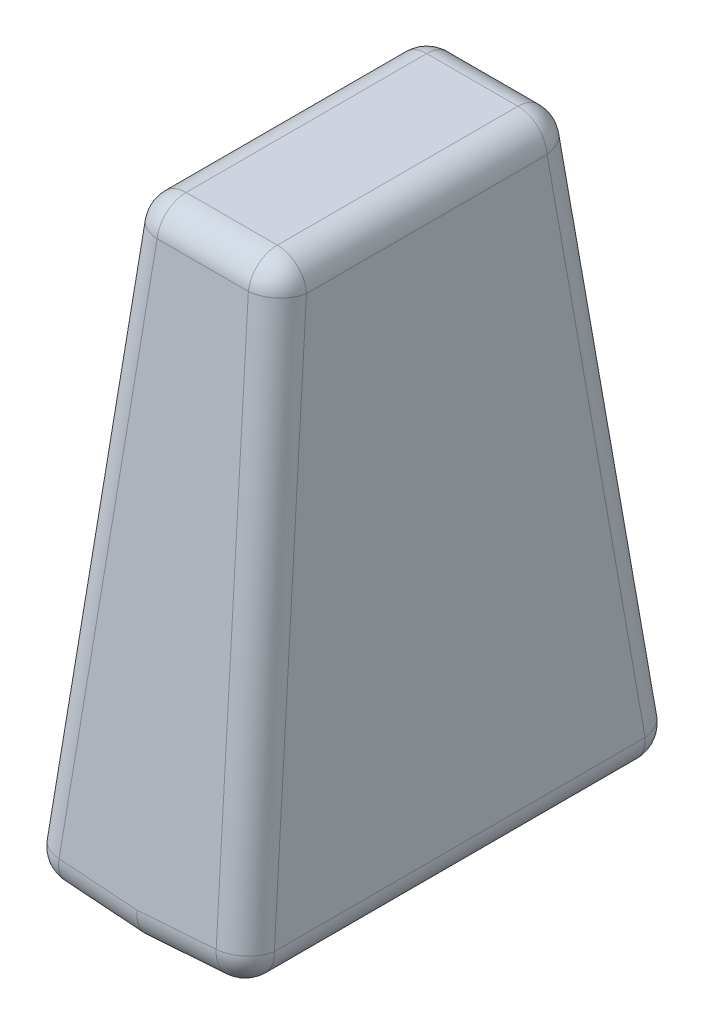
ISO-10303-21;
HEADER;
FILE_DESCRIPTION(('STEP AP214'),'2;1');
FILE_NAME('part.step','',(''),(''),'','','');
FILE_SCHEMA(('AUTOMOTIVE_DESIGN { 1 0 10303 214 1 1 1 1 }'));
ENDSEC;
DATA;
#1=APPLICATION_CONTEXT('core data for automotive mechanical design processes');
#2=APPLICATION_PROTOCOL_DEFINITION('international standard','automotive_design',2000,#1);
#3=PRODUCT_CONTEXT('',#1,'mechanical');
#4=PRODUCT('Part','Part','',(#3));
#5=PRODUCT_RELATED_PRODUCT_CATEGORY('part','',(#4));
#6=PRODUCT_DEFINITION_FORMATION('','',#4);
#7=PRODUCT_DEFINITION_CONTEXT('part definition',#1,'design');
#8=PRODUCT_DEFINITION('design','',#6,#7);
#9=PRODUCT_DEFINITION_SHAPE('','',#8);
#10=(LENGTH_UNIT() NAMED_UNIT(*) SI_UNIT(.MILLI.,.METRE.));
#11=(NAMED_UNIT(*) PLANE_ANGLE_UNIT() SI_UNIT($,.RADIAN.));
#12=(NAMED_UNIT(*) SI_UNIT($,.STERADIAN.) SOLID_ANGLE_UNIT());
#13=UNCERTAINTY_MEASURE_WITH_UNIT(LENGTH_MEASURE(1.E-05),#10,'distance_accuracy_value','');
#14=(GEOMETRIC_REPRESENTATION_CONTEXT(3) GLOBAL_UNCERTAINTY_ASSIGNED_CONTEXT((#13)) GLOBAL_UNIT_ASSIGNED_CONTEXT((#10,
#11,#12)) REPRESENTATION_CONTEXT('',''));
#15=CARTESIAN_POINT('',(0.,0.,0.));
#16=DIRECTION('',(0.,0.,1.));
#17=DIRECTION('',(1.,0.,0.));
#18=AXIS2_PLACEMENT_3D('',#15,#16,#17);
#19=CARTESIAN_POINT('',(-7.5,0.474375810233363,30.));
#20=DIRECTION('',(0.998005693706794,-0.0631239679426227,0.));
#21=DIRECTION('',(0.0631239679426227,0.998005693706794,0.));
#22=AXIS2_PLACEMENT_3D('',#19,#20,#21);
#23=PLANE('',#22);
#24=DIRECTION('',(0.,0.,-1.));
#25=VECTOR('',#24,1.);
#26=CARTESIAN_POINT('',(-5.11851502047879,38.1262479358852,30.));
#27=LINE('',#26,#25);
#28=CARTESIAN_POINT('',(-5.11851502047879,38.1262479358852,23.2344355629254));
#29=VERTEX_POINT('',#28);
#30=CARTESIAN_POINT('',(-5.11851502047879,38.1262479358852,6.76556443707463));
#31=VERTEX_POINT('',#30);
#32=EDGE_CURVE('E273',#29,#31,#27,.T.);
#33=ORIENTED_EDGE('',*,*,#32,.T.);
#34=DIRECTION('',(-0.0626384368425674,-0.990329325789502,-0.123791165723688));
#35=VECTOR('',#34,1.);
#36=CARTESIAN_POINT('',(-7.28334373137214,3.89976551109013,2.48725413397524));
#37=LINE('',#36,#35);
#38=CARTESIAN_POINT('',(-7.37375206411475,2.47038719764695,2.30858184479484));
#39=VERTEX_POINT('',#38);
#40=EDGE_CURVE('E201',#31,#39,#37,.T.);
#41=ORIENTED_EDGE('',*,*,#40,.T.);
#42=DIRECTION('',(0.,0.,-1.));
#43=VECTOR('',#42,1.);
#44=CARTESIAN_POINT('',(-7.37375206411475,2.47038719764695,30.));
#45=LINE('',#44,#43);
#46=CARTESIAN_POINT('',(-7.37375206411475,2.47038719764695,27.6914181552051));
#47=VERTEX_POINT('',#46);
#48=EDGE_CURVE('E174',#47,#39,#45,.T.);
#49=ORIENTED_EDGE('',*,*,#48,.F.);
#50=DIRECTION('',(-0.0626384368425674,-0.990329325789502,0.123791165723688));
#51=VECTOR('',#50,1.);
#52=CARTESIAN_POINT('',(-5.13402151152527,37.881086440843,23.2650807498056));
#53=LINE('',#52,#51);
#54=EDGE_CURVE('E198',#47,#29,#53,.F.);
#55=ORIENTED_EDGE('',*,*,#54,.T.);
#56=EDGE_LOOP('',(#33,#41,#49,#55));
#57=FACE_BOUND('',#56,.T.);
#58=ADVANCED_FACE('F40',(#57),#23,.F.);
#59=CARTESIAN_POINT('',(-5.37774067670117,2.34413926176169,30.));
#60=DIRECTION('',(0.,0.,-1.));
#61=DIRECTION('',(-1.,0.,0.));
#62=AXIS2_PLACEMENT_3D('',#59,#60,#61);
#63=CYLINDRICAL_SURFACE('',#62,2.);
#64=ORIENTED_EDGE('',*,*,#48,.T.);
#65=CARTESIAN_POINT('',(-5.37774067670117,2.34413926176169,2.30858184479484));
#66=DIRECTION('',(0.,0.,-1.));
#67=DIRECTION('',(-1.,0.,0.));
#68=AXIS2_PLACEMENT_3D('',#65,#66,#67);
#69=CIRCLE('',#68,2.);
#70=CARTESIAN_POINT('',(-5.50398861258639,0.348127874348098,2.30858184479484));
#71=VERTEX_POINT('',#70);
#72=EDGE_CURVE('E207',#39,#71,#69,.F.);
#73=ORIENTED_EDGE('',*,*,#72,.T.);
#74=DIRECTION('',(0.,0.,-1.));
#75=VECTOR('',#74,1.);
#76=CARTESIAN_POINT('',(-5.50398861258639,0.348127874348098,30.));
#77=LINE('',#76,#75);
#78=CARTESIAN_POINT('',(-5.50398861258639,0.348127874348098,27.6914181552052));
#79=VERTEX_POINT('',#78);
#80=EDGE_CURVE('E322',#79,#71,#77,.T.);
#81=ORIENTED_EDGE('',*,*,#80,.F.);
#82=CARTESIAN_POINT('',(-5.37774067670117,2.34413926176169,27.6914181552052));
#83=DIRECTION('',(0.,0.,-1.));
#84=DIRECTION('',(-1.,0.,0.));
#85=AXIS2_PLACEMENT_3D('',#82,#83,#84);
#86=CIRCLE('',#85,2.);
#87=EDGE_CURVE('E204',#79,#47,#86,.T.);
#88=ORIENTED_EDGE('',*,*,#87,.T.);
#89=EDGE_LOOP('',(#64,#73,#81,#88));
#90=FACE_BOUND('',#89,.T.);
#91=ADVANCED_FACE('F319',(#90),#63,.T.);
#92=CARTESIAN_POINT('',(0.,0.,30.));
#93=DIRECTION('',(0.0631239679426192,0.998005693706794,0.));
#94=DIRECTION('',(-0.998005693706794,0.0631239679426192,0.));
#95=AXIS2_PLACEMENT_3D('',#92,#93,#94);
#96=PLANE('',#95);
#97=ORIENTED_EDGE('',*,*,#80,.T.);
#98=DIRECTION('',(0.997974627276607,-0.0631220029875538,-0.00789025037344378));
#99=VECTOR('',#98,1.);
#100=CARTESIAN_POINT('',(-0.218392350848216,0.0138133397843181,2.26679252797437));
#101=LINE('',#100,#99);
#102=CARTESIAN_POINT('',(0.,0.,2.26506586050133));
#103=VERTEX_POINT('',#102);
#104=EDGE_CURVE('E213',#71,#103,#101,.T.);
#105=ORIENTED_EDGE('',*,*,#104,.T.);
#106=DIRECTION('',(0.,0.,-1.));
#107=VECTOR('',#106,1.);
#108=CARTESIAN_POINT('',(0.,0.,30.));
#109=LINE('',#108,#107);
#110=CARTESIAN_POINT('',(0.,0.,27.7349341394987));
#111=VERTEX_POINT('',#110);
#112=EDGE_CURVE('E330',#111,#103,#109,.T.);
#113=ORIENTED_EDGE('',*,*,#112,.F.);
#114=DIRECTION('',(0.997974627276607,-0.0631220029875538,0.00789025037344379));
#115=VECTOR('',#114,1.);
#116=CARTESIAN_POINT('',(-5.48615287316791,0.346999761903064,27.6915591692608));
#117=LINE('',#116,#115);
#118=EDGE_CURVE('E210',#111,#79,#117,.F.);
#119=ORIENTED_EDGE('',*,*,#118,.T.);
#120=EDGE_LOOP('',(#97,#105,#113,#119));
#121=FACE_BOUND('',#120,.T.);
#122=ADVANCED_FACE('F432',(#121),#96,.F.);
#123=CARTESIAN_POINT('',(0.,0.,30.));
#124=DIRECTION('',(0.0631239679426192,-0.998005693706794,0.));
#125=DIRECTION('',(0.998005693706794,0.0631239679426192,0.));
#126=AXIS2_PLACEMENT_3D('',#123,#124,#125);
#127=PLANE('',#126);
#128=ORIENTED_EDGE('',*,*,#112,.T.);
#129=DIRECTION('',(-0.997974627276607,-0.0631220029875538,-0.00789025037344466));
#130=VECTOR('',#129,1.);
#131=CARTESIAN_POINT('',(5.48615287316791,0.346999761903064,2.30844083073922));
#132=LINE('',#131,#130);
#133=CARTESIAN_POINT('',(5.50398861258639,0.348127874348098,2.30858184479485));
#134=VERTEX_POINT('',#133);
#135=EDGE_CURVE('E219',#103,#134,#132,.F.);
#136=ORIENTED_EDGE('',*,*,#135,.T.);
#137=DIRECTION('',(0.,0.,-1.));
#138=VECTOR('',#137,1.);
#139=CARTESIAN_POINT('',(5.50398861258639,0.348127874348098,30.));
#140=LINE('',#139,#138);
#141=CARTESIAN_POINT('',(5.50398861258639,0.348127874348098,27.6914181552051));
#142=VERTEX_POINT('',#141);
#143=EDGE_CURVE('E378',#142,#134,#140,.T.);
#144=ORIENTED_EDGE('',*,*,#143,.F.);
#145=DIRECTION('',(-0.997974627276607,-0.0631220029875538,0.00789025037344466));
#146=VECTOR('',#145,1.);
#147=CARTESIAN_POINT('',(-0.0178357394184863,-0.00112811244503402,27.7350751535543));
#148=LINE('',#147,#146);
#149=EDGE_CURVE('E216',#142,#111,#148,.T.);
#150=ORIENTED_EDGE('',*,*,#149,.T.);
#151=EDGE_LOOP('',(#128,#136,#144,#150));
#152=FACE_BOUND('',#151,.T.);
#153=ADVANCED_FACE('F385',(#152),#127,.T.);
#154=CARTESIAN_POINT('',(5.37774067670117,2.34413926176169,30.));
#155=DIRECTION('',(0.,0.,-1.));
#156=DIRECTION('',(-1.,0.,0.));
#157=AXIS2_PLACEMENT_3D('',#154,#155,#156);
#158=CYLINDRICAL_SURFACE('',#157,2.);
#159=ORIENTED_EDGE('',*,*,#143,.T.);
#160=CARTESIAN_POINT('',(5.37774067670117,2.34413926176169,2.30858184479485));
#161=DIRECTION('',(0.,0.,-1.));
#162=DIRECTION('',(-1.,0.,0.));
#163=AXIS2_PLACEMENT_3D('',#160,#161,#162);
#164=CIRCLE('',#163,2.);
#165=CARTESIAN_POINT('',(7.37375206411475,2.47038719764695,2.30858184479485));
#166=VERTEX_POINT('',#165);
#167=EDGE_CURVE('E225',#134,#166,#164,.F.);
#168=ORIENTED_EDGE('',*,*,#167,.T.);
#169=DIRECTION('',(0.,0.,-1.));
#170=VECTOR('',#169,1.);
#171=CARTESIAN_POINT('',(7.37375206411475,2.47038719764695,30.));
#172=LINE('',#171,#170);
#173=CARTESIAN_POINT('',(7.37375206411475,2.47038719764695,27.6914181552051));
#174=VERTEX_POINT('',#173);
#175=EDGE_CURVE('E374',#174,#166,#172,.T.);
#176=ORIENTED_EDGE('',*,*,#175,.F.);
#177=CARTESIAN_POINT('',(5.37774067670117,2.34413926176169,27.6914181552051));
#178=DIRECTION('',(0.,0.,-1.));
#179=DIRECTION('',(-1.,0.,0.));
#180=AXIS2_PLACEMENT_3D('',#177,#178,#179);
#181=CIRCLE('',#180,2.);
#182=EDGE_CURVE('E222',#174,#142,#181,.T.);
#183=ORIENTED_EDGE('',*,*,#182,.T.);
#184=EDGE_LOOP('',(#159,#168,#176,#183));
#185=FACE_BOUND('',#184,.T.);
#186=ADVANCED_FACE('F398',(#185),#158,.T.);
#187=CARTESIAN_POINT('',(7.5,0.474375810233363,30.));
#188=DIRECTION('',(0.998005693706794,0.0631239679426227,0.));
#189=DIRECTION('',(-0.0631239679426227,0.998005693706794,0.));
#190=AXIS2_PLACEMENT_3D('',#187,#188,#189);
#191=PLANE('',#190);
#192=ORIENTED_EDGE('',*,*,#175,.T.);
#193=DIRECTION('',(0.0626384368425674,-0.990329325789502,-0.123791165723688));
#194=VECTOR('',#193,1.);
#195=CARTESIAN_POINT('',(5.13402151152528,37.881086440843,6.73491925019436));
#196=LINE('',#195,#194);
#197=CARTESIAN_POINT('',(5.11851502047879,38.1262479358852,6.76556443707464));
#198=VERTEX_POINT('',#197);
#199=EDGE_CURVE('E231',#166,#198,#196,.F.);
#200=ORIENTED_EDGE('',*,*,#199,.T.);
#201=DIRECTION('',(0.,0.,-1.));
#202=VECTOR('',#201,1.);
#203=CARTESIAN_POINT('',(5.11851502047879,38.1262479358852,30.));
#204=LINE('',#203,#202);
#205=CARTESIAN_POINT('',(5.11851502047879,38.1262479358852,23.2344355629254));
#206=VERTEX_POINT('',#205);
#207=EDGE_CURVE('E367',#206,#198,#204,.T.);
#208=ORIENTED_EDGE('',*,*,#207,.F.);
#209=DIRECTION('',(0.0626384368425674,-0.990329325789502,0.123791165723688));
#210=VECTOR('',#209,1.);
#211=CARTESIAN_POINT('',(7.51596628484767,0.221944860395039,27.9724734473616));
#212=LINE('',#211,#210);
#213=EDGE_CURVE('E228',#206,#174,#212,.T.);
#214=ORIENTED_EDGE('',*,*,#213,.T.);
#215=EDGE_LOOP('',(#192,#200,#208,#214));
#216=FACE_BOUND('',#215,.T.);
#217=ADVANCED_FACE('F401',(#216),#191,.T.);
#218=CARTESIAN_POINT('',(3.1225036330652,38.,30.));
#219=DIRECTION('',(0.,0.,-1.));
#220=DIRECTION('',(-1.,0.,0.));
#221=AXIS2_PLACEMENT_3D('',#218,#219,#220);
#222=CYLINDRICAL_SURFACE('',#221,2.);
#223=ORIENTED_EDGE('',*,*,#207,.T.);
#224=CARTESIAN_POINT('',(3.1225036330652,38.,6.76556443707464));
#225=DIRECTION('',(0.,0.,-1.));
#226=DIRECTION('',(-1.,0.,0.));
#227=AXIS2_PLACEMENT_3D('',#224,#225,#226);
#228=CIRCLE('',#227,2.);
#229=CARTESIAN_POINT('',(3.12250363306518,40.,6.76556443707464));
#230=VERTEX_POINT('',#229);
#231=EDGE_CURVE('E159',#198,#230,#228,.F.);
#232=ORIENTED_EDGE('',*,*,#231,.T.);
#233=DIRECTION('',(0.,0.,-1.));
#234=VECTOR('',#233,1.);
#235=CARTESIAN_POINT('',(3.12250363306518,40.,30.));
#236=LINE('',#235,#234);
#237=CARTESIAN_POINT('',(3.12250363306518,40.,23.2344355629254));
#238=VERTEX_POINT('',#237);
#239=EDGE_CURVE('E360',#238,#230,#236,.T.);
#240=ORIENTED_EDGE('',*,*,#239,.F.);
#241=CARTESIAN_POINT('',(3.1225036330652,38.,23.2344355629254));
#242=DIRECTION('',(0.,0.,-1.));
#243=DIRECTION('',(-1.,0.,0.));
#244=AXIS2_PLACEMENT_3D('',#241,#242,#243);
#245=CIRCLE('',#244,2.);
#246=EDGE_CURVE('E234',#238,#206,#245,.T.);
#247=ORIENTED_EDGE('',*,*,#246,.T.);
#248=EDGE_LOOP('',(#223,#232,#240,#247));
#249=FACE_BOUND('',#248,.T.);
#250=ADVANCED_FACE('F410',(#249),#222,.T.);
#251=CARTESIAN_POINT('',(0.,40.,30.));
#252=DIRECTION('',(0.,-1.,0.));
#253=DIRECTION('',(0.,0.,-1.));
#254=AXIS2_PLACEMENT_3D('',#251,#252,#253);
#255=PLANE('',#254);
#256=ORIENTED_EDGE('',*,*,#239,.T.);
#257=DIRECTION('',(1.,0.,0.));
#258=VECTOR('',#257,1.);
#259=CARTESIAN_POINT('',(0.,40.,6.76556443707464));
#260=LINE('',#259,#258);
#261=CARTESIAN_POINT('',(-3.12250363306518,40.,6.76556443707463));
#262=VERTEX_POINT('',#261);
#263=EDGE_CURVE('E149',#230,#262,#260,.F.);
#264=ORIENTED_EDGE('',*,*,#263,.T.);
#265=DIRECTION('',(0.,0.,-1.));
#266=VECTOR('',#265,1.);
#267=CARTESIAN_POINT('',(-3.12250363306518,40.,30.));
#268=LINE('',#267,#266);
#269=CARTESIAN_POINT('',(-3.12250363306518,40.,23.2344355629254));
#270=VERTEX_POINT('',#269);
#271=EDGE_CURVE('E357',#270,#262,#268,.T.);
#272=ORIENTED_EDGE('',*,*,#271,.F.);
#273=DIRECTION('',(1.,0.,0.));
#274=VECTOR('',#273,1.);
#275=CARTESIAN_POINT('',(3.12250363306518,40.,23.2344355629254));
#276=LINE('',#275,#274);
#277=EDGE_CURVE('E181',#270,#238,#276,.T.);
#278=ORIENTED_EDGE('',*,*,#277,.T.);
#279=EDGE_LOOP('',(#256,#264,#272,#278));
#280=FACE_BOUND('',#279,.T.);
#281=ADVANCED_FACE('F356',(#280),#255,.F.);
#282=CARTESIAN_POINT('',(-3.1225036330652,38.,30.));
#283=DIRECTION('',(0.,0.,-1.));
#284=DIRECTION('',(-1.,0.,0.));
#285=AXIS2_PLACEMENT_3D('',#282,#283,#284);
#286=CYLINDRICAL_SURFACE('',#285,2.);
#287=ORIENTED_EDGE('',*,*,#271,.T.);
#288=CARTESIAN_POINT('',(-3.1225036330652,38.,6.76556443707463));
#289=DIRECTION('',(0.,0.,-1.));
#290=DIRECTION('',(-1.,0.,0.));
#291=AXIS2_PLACEMENT_3D('',#288,#289,#290);
#292=CIRCLE('',#291,2.);
#293=EDGE_CURVE('E195',#262,#31,#292,.F.);
#294=ORIENTED_EDGE('',*,*,#293,.T.);
#295=ORIENTED_EDGE('',*,*,#32,.F.);
#296=CARTESIAN_POINT('',(-3.1225036330652,38.,23.2344355629254));
#297=DIRECTION('',(0.,0.,-1.));
#298=DIRECTION('',(-1.,0.,0.));
#299=AXIS2_PLACEMENT_3D('',#296,#297,#298);
#300=CIRCLE('',#299,2.);
#301=EDGE_CURVE('E192',#29,#270,#300,.T.);
#302=ORIENTED_EDGE('',*,*,#301,.T.);
#303=EDGE_LOOP('',(#287,#294,#295,#302));
#304=FACE_BOUND('',#303,.T.);
#305=ADVANCED_FACE('F361',(#304),#286,.T.);
#306=CARTESIAN_POINT('',(-7.37774067670131,0.,0.));
#307=DIRECTION('',(0.,-0.124034734589208,0.992277876713668));
#308=DIRECTION('',(0.,-0.992277876713668,-0.124034734589208));
#309=AXIS2_PLACEMENT_3D('',#306,#307,#308);
#310=PLANE('',#309);
#311=DIRECTION('',(-0.0626384368425674,-0.990329325789502,-0.123791165723688));
#312=VECTOR('',#311,1.);
#313=CARTESIAN_POINT('',(-5.54890200723564,-0.11389463967031,-0.0142368299587911));
#314=LINE('',#313,#312);
#315=CARTESIAN_POINT('',(-5.37774067670117,2.5922087309401,0.32402609136751));
#316=VERTEX_POINT('',#315);
#317=CARTESIAN_POINT('',(-3.1225036330652,38.2480694691784,4.7810086836473));
#318=VERTEX_POINT('',#317);
#319=EDGE_CURVE('E178',#316,#318,#314,.F.);
#320=ORIENTED_EDGE('',*,*,#319,.T.);
#321=DIRECTION('',(1.,0.,0.));
#322=VECTOR('',#321,1.);
#323=CARTESIAN_POINT('',(-7.37774067670131,38.2480694691784,4.7810086836473));
#324=LINE('',#323,#322);
#325=CARTESIAN_POINT('',(3.1225036330652,38.2480694691784,4.7810086836473));
#326=VERTEX_POINT('',#325);
#327=EDGE_CURVE('E147',#318,#326,#324,.T.);
#328=ORIENTED_EDGE('',*,*,#327,.T.);
#329=DIRECTION('',(0.0626384368425674,-0.990329325789502,-0.123791165723688));
#330=VECTOR('',#329,1.);
#331=CARTESIAN_POINT('',(5.39324716774766,2.3470472358979,0.293380904487241));
#332=LINE('',#331,#330);
#333=CARTESIAN_POINT('',(5.37774067670117,2.5922087309401,0.324026091367515));
#334=VERTEX_POINT('',#333);
#335=EDGE_CURVE('E166',#326,#334,#332,.T.);
#336=ORIENTED_EDGE('',*,*,#335,.T.);
#337=DIRECTION('',(-0.997974627276607,-0.0631220029875538,-0.00789025037344466));
#338=VECTOR('',#337,1.);
#339=CARTESIAN_POINT('',(-0.144083675303724,2.24295274414697,0.280369093018372));
#340=LINE('',#339,#338);
#341=CARTESIAN_POINT('',(0.,2.25206605217545,0.281508256521931));
#342=VERTEX_POINT('',#341);
#343=EDGE_CURVE('E173',#334,#342,#340,.T.);
#344=ORIENTED_EDGE('',*,*,#343,.T.);
#345=DIRECTION('',(0.997974627276607,-0.0631220029875538,-0.00789025037344379));
#346=VECTOR('',#345,1.);
#347=CARTESIAN_POINT('',(-7.20380191642968,2.70770730162436,0.338463412703041));
#348=LINE('',#347,#346);
#349=EDGE_CURVE('E186',#342,#316,#348,.F.);
#350=ORIENTED_EDGE('',*,*,#349,.T.);
#351=EDGE_LOOP('',(#320,#328,#336,#344,#350));
#352=FACE_BOUND('',#351,.T.);
#353=ADVANCED_FACE('F176',(#352),#310,.F.);
#354=CARTESIAN_POINT('',(-7.37774067670129,3.69230769230772,29.5384615384615));
#355=DIRECTION('',(0.,0.124034734589208,0.992277876713668));
#356=DIRECTION('',(0.,-0.992277876713668,0.124034734589208));
#357=AXIS2_PLACEMENT_3D('',#354,#355,#356);
#358=PLANE('',#357);
#359=DIRECTION('',(-0.997974627276607,-0.0631220029875538,0.00789025037344466));
#360=VECTOR('',#359,1.);
#361=CARTESIAN_POINT('',(-7.2557411767704,1.79313963889894,29.7758575451376));
#362=LINE('',#361,#360);
#363=CARTESIAN_POINT('',(0.,2.25206605217545,29.7184917434781));
#364=VERTEX_POINT('',#363);
#365=CARTESIAN_POINT('',(5.37774067670117,2.5922087309401,29.6759739086325));
#366=VERTEX_POINT('',#365);
#367=EDGE_CURVE('E50',#364,#366,#362,.F.);
#368=ORIENTED_EDGE('',*,*,#367,.T.);
#369=DIRECTION('',(0.0626384368425674,-0.990329325789502,0.123791165723688));
#370=VECTOR('',#369,1.);
#371=CARTESIAN_POINT('',(5.25838523415699,4.47924807774187,29.4400939902823));
#372=LINE('',#371,#370);
#373=CARTESIAN_POINT('',(3.1225036330652,38.2480694691784,25.2189913163527));
#374=VERTEX_POINT('',#373);
#375=EDGE_CURVE('E11',#366,#374,#372,.F.);
#376=ORIENTED_EDGE('',*,*,#375,.T.);
#377=DIRECTION('',(1.,0.,0.));
#378=VECTOR('',#377,1.);
#379=CARTESIAN_POINT('',(-3.12250363306518,38.2480694691784,25.2189913163527));
#380=LINE('',#379,#378);
#381=CARTESIAN_POINT('',(-3.1225036330652,38.2480694691784,25.2189913163527));
#382=VERTEX_POINT('',#381);
#383=EDGE_CURVE('E240',#374,#382,#380,.F.);
#384=ORIENTED_EDGE('',*,*,#383,.T.);
#385=DIRECTION('',(-0.0626384368425674,-0.990329325789502,0.123791165723688));
#386=VECTOR('',#385,1.);
#387=CARTESIAN_POINT('',(-5.39324716774765,2.3470472358979,29.7066190955128));
#388=LINE('',#387,#386);
#389=CARTESIAN_POINT('',(-5.37774067670117,2.5922087309401,29.6759739086325));
#390=VERTEX_POINT('',#389);
#391=EDGE_CURVE('E243',#382,#390,#388,.T.);
#392=ORIENTED_EDGE('',*,*,#391,.T.);
#393=DIRECTION('',(0.997974627276607,-0.0631220029875538,0.00789025037344379));
#394=VECTOR('',#393,1.);
#395=CARTESIAN_POINT('',(0.144083675303723,2.24295274414697,29.7196309069816));
#396=LINE('',#395,#394);
#397=EDGE_CURVE('E61',#390,#364,#396,.T.);
#398=ORIENTED_EDGE('',*,*,#397,.T.);
#399=EDGE_LOOP('',(#368,#376,#384,#392,#398));
#400=FACE_BOUND('',#399,.T.);
#401=ADVANCED_FACE('F418',(#400),#358,.T.);
#402=CARTESIAN_POINT('',(-0.0921444149629774,2.00982472719791,2.26679252797437));
#403=DIRECTION('',(0.997974627276607,-0.0631220029875538,-0.00789025037344379));
#404=DIRECTION('',(0.0631239679426192,0.998005693706794,0.));
#405=AXIS2_PLACEMENT_3D('',#402,#403,#404);
#406=CYLINDRICAL_SURFACE('',#405,2.);
#407=CARTESIAN_POINT('',(-5.37774067670117,2.34413926176169,2.30858184479485));
#408=DIRECTION('',(-0.997974627276608,0.0631220029875469,0.00789025037344292));
#409=DIRECTION('',(-0.0631239679426124,-0.998005693706794,0.));
#410=AXIS2_PLACEMENT_3D('',#407,#408,#409);
#411=CIRCLE('',#410,2.);
#412=EDGE_CURVE('E265',#316,#71,#411,.T.);
#413=ORIENTED_EDGE('',*,*,#412,.F.);
#414=ORIENTED_EDGE('',*,*,#349,.F.);
#415=CARTESIAN_POINT('',(0.,2.00399658299703,2.26606400994927));
#416=DIRECTION('',(1.,0.,0.));
#417=DIRECTION('',(0.,0.992277876713668,0.124034734589208));
#418=AXIS2_PLACEMENT_3D('',#415,#416,#417);
#419=ELLIPSE('',#418,2.00405896636655,2.);
#420=EDGE_CURVE('E269',#103,#342,#419,.T.);
#421=ORIENTED_EDGE('',*,*,#420,.F.);
#422=ORIENTED_EDGE('',*,*,#104,.F.);
#423=EDGE_LOOP('',(#413,#414,#421,#422));
#424=FACE_BOUND('',#423,.T.);
#425=ADVANCED_FACE('F342',(#424),#406,.T.);
#426=CARTESIAN_POINT('',(-7.49196926703713,1.53012871749117,2.20683052676103));
#427=DIRECTION('',(0.997974627276607,0.0631220029875538,0.00789025037344466));
#428=DIRECTION('',(-0.0631239679426192,0.998005693706794,0.));
#429=AXIS2_PLACEMENT_3D('',#426,#427,#428);
#430=CYLINDRICAL_SURFACE('',#429,2.);
#431=ORIENTED_EDGE('',*,*,#420,.T.);
#432=ORIENTED_EDGE('',*,*,#343,.F.);
#433=CARTESIAN_POINT('',(5.37774067670115,2.34413926176169,2.30858184479485));
#434=DIRECTION('',(0.997974627276607,0.0631220029875538,0.00789025037344467));
#435=DIRECTION('',(-0.0631239679426193,0.998005693706794,0.));
#436=AXIS2_PLACEMENT_3D('',#433,#434,#435);
#437=CIRCLE('',#436,2.);
#438=EDGE_CURVE('E261',#134,#334,#437,.T.);
#439=ORIENTED_EDGE('',*,*,#438,.F.);
#440=ORIENTED_EDGE('',*,*,#135,.F.);
#441=EDGE_LOOP('',(#431,#432,#439,#440));
#442=FACE_BOUND('',#441,.T.);
#443=ADVANCED_FACE('F392',(#442),#430,.T.);
#444=CARTESIAN_POINT('',(-5.37774067670117,2.34413926176169,2.30858184479484));
#445=DIRECTION('',(0.,-0.124034734589208,0.992277876713668));
#446=DIRECTION('',(0.,-0.992277876713668,-0.124034734589208));
#447=AXIS2_PLACEMENT_3D('',#444,#445,#446);
#448=SPHERICAL_SURFACE('',#447,2.);
#449=ORIENTED_EDGE('',*,*,#412,.T.);
#450=ORIENTED_EDGE('',*,*,#72,.F.);
#451=CARTESIAN_POINT('',(-5.37774067670117,2.34413926176169,2.30858184479484));
#452=DIRECTION('',(0.0626384368425749,0.990329325789502,0.123791165723688));
#453=DIRECTION('',(0.,-0.124034734589208,0.992277876713668));
#454=AXIS2_PLACEMENT_3D('',#451,#452,#453);
#455=CIRCLE('',#454,2.);
#456=EDGE_CURVE('E257',#316,#39,#455,.T.);
#457=ORIENTED_EDGE('',*,*,#456,.F.);
#458=EDGE_LOOP('',(#449,#450,#457));
#459=FACE_BOUND('',#458,.T.);
#460=ADVANCED_FACE('F344',(#459),#448,.T.);
#461=CARTESIAN_POINT('',(5.37774067670117,2.34413926176169,2.30858184479485));
#462=DIRECTION('',(0.,-0.124034734589208,0.992277876713668));
#463=DIRECTION('',(0.,-0.992277876713668,-0.124034734589208));
#464=AXIS2_PLACEMENT_3D('',#461,#462,#463);
#465=SPHERICAL_SURFACE('',#464,2.);
#466=ORIENTED_EDGE('',*,*,#167,.F.);
#467=ORIENTED_EDGE('',*,*,#438,.T.);
#468=CARTESIAN_POINT('',(5.37774067670117,2.34413926176169,2.30858184479485));
#469=DIRECTION('',(-0.0626384368425748,0.990329325789502,0.123791165723688));
#470=DIRECTION('',(0.,-0.124034734589208,0.992277876713668));
#471=AXIS2_PLACEMENT_3D('',#468,#469,#470);
#472=CIRCLE('',#471,2.);
#473=EDGE_CURVE('E169',#166,#334,#472,.T.);
#474=ORIENTED_EDGE('',*,*,#473,.F.);
#475=EDGE_LOOP('',(#466,#467,#474));
#476=FACE_BOUND('',#475,.T.);
#477=ADVANCED_FACE('F395',(#476),#465,.T.);
#478=CARTESIAN_POINT('',(-5.28733234395855,3.77351757520488,2.48725413397524));
#479=DIRECTION('',(-0.0626384368425674,-0.990329325789503,-0.123791165723688));
#480=DIRECTION('',(0.,0.124034734589208,-0.992277876713668));
#481=AXIS2_PLACEMENT_3D('',#478,#479,#480);
#482=CYLINDRICAL_SURFACE('',#481,2.);
#483=ORIENTED_EDGE('',*,*,#456,.T.);
#484=ORIENTED_EDGE('',*,*,#40,.F.);
#485=CARTESIAN_POINT('',(-3.1225036330652,38.,6.76556443707463));
#486=DIRECTION('',(0.0626384368425612,0.990329325789503,0.123791165723687));
#487=DIRECTION('',(0.,-0.124034734589208,0.992277876713668));
#488=AXIS2_PLACEMENT_3D('',#485,#486,#487);
#489=CIRCLE('',#488,2.);
#490=EDGE_CURVE('E163',#318,#31,#489,.T.);
#491=ORIENTED_EDGE('',*,*,#490,.F.);
#492=ORIENTED_EDGE('',*,*,#319,.F.);
#493=EDGE_LOOP('',(#483,#484,#491,#492));
#494=FACE_BOUND('',#493,.T.);
#495=ADVANCED_FACE('F346',(#494),#482,.T.);
#496=CARTESIAN_POINT('',(5.49100778763252,0.553357957868364,2.08473418180819));
#497=DIRECTION('',(-0.0626384368425674,0.990329325789503,0.123791165723688));
#498=DIRECTION('',(0.,-0.124034734589208,0.992277876713668));
#499=AXIS2_PLACEMENT_3D('',#496,#497,#498);
#500=CYLINDRICAL_SURFACE('',#499,2.);
#501=ORIENTED_EDGE('',*,*,#473,.T.);
#502=ORIENTED_EDGE('',*,*,#335,.F.);
#503=CARTESIAN_POINT('',(3.1225036330652,38.,6.76556443707464));
#504=DIRECTION('',(-0.0626384368425683,0.990329325789502,0.123791165723687));
#505=DIRECTION('',(0.,-0.124034734589207,0.992277876713668));
#506=AXIS2_PLACEMENT_3D('',#503,#504,#505);
#507=CIRCLE('',#506,2.);
#508=EDGE_CURVE('E156',#198,#326,#507,.T.);
#509=ORIENTED_EDGE('',*,*,#508,.F.);
#510=ORIENTED_EDGE('',*,*,#199,.F.);
#511=EDGE_LOOP('',(#501,#502,#509,#510));
#512=FACE_BOUND('',#511,.T.);
#513=ADVANCED_FACE('F167',(#512),#500,.T.);
#514=CARTESIAN_POINT('',(-3.1225036330652,38.,6.76556443707463));
#515=DIRECTION('',(0.,-0.124034734589208,0.992277876713668));
#516=DIRECTION('',(0.,-0.992277876713668,-0.124034734589208));
#517=AXIS2_PLACEMENT_3D('',#514,#515,#516);
#518=SPHERICAL_SURFACE('',#517,2.);
#519=ORIENTED_EDGE('',*,*,#490,.T.);
#520=ORIENTED_EDGE('',*,*,#293,.F.);
#521=CARTESIAN_POINT('',(-3.1225036330652,38.,6.76556443707463));
#522=DIRECTION('',(1.,0.,0.));
#523=DIRECTION('',(0.,1.,0.));
#524=AXIS2_PLACEMENT_3D('',#521,#522,#523);
#525=CIRCLE('',#524,2.);
#526=EDGE_CURVE('E153',#318,#262,#525,.T.);
#527=ORIENTED_EDGE('',*,*,#526,.F.);
#528=EDGE_LOOP('',(#519,#520,#527));
#529=FACE_BOUND('',#528,.T.);
#530=ADVANCED_FACE('F350',(#529),#518,.T.);
#531=CARTESIAN_POINT('',(3.1225036330652,38.,6.76556443707464));
#532=DIRECTION('',(0.,-0.124034734589208,0.992277876713668));
#533=DIRECTION('',(0.,-0.992277876713668,-0.124034734589208));
#534=AXIS2_PLACEMENT_3D('',#531,#532,#533);
#535=SPHERICAL_SURFACE('',#534,2.);
#536=ORIENTED_EDGE('',*,*,#231,.F.);
#537=ORIENTED_EDGE('',*,*,#508,.T.);
#538=CARTESIAN_POINT('',(3.1225036330652,38.,6.76556443707464));
#539=DIRECTION('',(-1.,0.,0.));
#540=DIRECTION('',(0.,-1.,0.));
#541=AXIS2_PLACEMENT_3D('',#538,#539,#540);
#542=CIRCLE('',#541,2.);
#543=EDGE_CURVE('E143',#230,#326,#542,.T.);
#544=ORIENTED_EDGE('',*,*,#543,.F.);
#545=EDGE_LOOP('',(#536,#537,#544));
#546=FACE_BOUND('',#545,.T.);
#547=ADVANCED_FACE('F158',(#546),#535,.T.);
#548=CARTESIAN_POINT('',(-7.37774067670131,38.,6.76556443707463));
#549=DIRECTION('',(1.,0.,0.));
#550=DIRECTION('',(0.,0.,-1.));
#551=AXIS2_PLACEMENT_3D('',#548,#549,#550);
#552=CYLINDRICAL_SURFACE('',#551,2.);
#553=ORIENTED_EDGE('',*,*,#526,.T.);
#554=ORIENTED_EDGE('',*,*,#263,.F.);
#555=ORIENTED_EDGE('',*,*,#543,.T.);
#556=ORIENTED_EDGE('',*,*,#327,.F.);
#557=EDGE_LOOP('',(#553,#554,#555,#556));
#558=FACE_BOUND('',#557,.T.);
#559=ADVANCED_FACE('F145',(#558),#552,.T.);
#560=CARTESIAN_POINT('',(-5.37774067670117,2.34413926176169,27.6914181552052));
#561=DIRECTION('',(0.,0.124034734589208,0.992277876713668));
#562=DIRECTION('',(0.,-0.992277876713668,0.124034734589208));
#563=AXIS2_PLACEMENT_3D('',#560,#561,#562);
#564=SPHERICAL_SURFACE('',#563,2.);
#565=CARTESIAN_POINT('',(-5.37774067670117,2.34413926176169,27.6914181552052));
#566=DIRECTION('',(0.0626384368425748,0.990329325789502,-0.123791165723688));
#567=DIRECTION('',(0.,0.124034734589208,0.992277876713668));
#568=AXIS2_PLACEMENT_3D('',#565,#566,#567);
#569=CIRCLE('',#568,2.);
#570=EDGE_CURVE('E300',#47,#390,#569,.T.);
#571=ORIENTED_EDGE('',*,*,#570,.F.);
#572=ORIENTED_EDGE('',*,*,#87,.F.);
#573=CARTESIAN_POINT('',(-5.37774067670117,2.34413926176169,27.6914181552052));
#574=DIRECTION('',(0.997974627276608,-0.0631220029875469,0.00789025037344293));
#575=DIRECTION('',(0.0631239679426124,0.998005693706794,0.));
#576=AXIS2_PLACEMENT_3D('',#573,#574,#575);
#577=CIRCLE('',#576,2.);
#578=EDGE_CURVE('E44',#390,#79,#577,.T.);
#579=ORIENTED_EDGE('',*,*,#578,.F.);
#580=EDGE_LOOP('',(#571,#572,#579));
#581=FACE_BOUND('',#580,.T.);
#582=ADVANCED_FACE('F42',(#581),#564,.T.);
#583=CARTESIAN_POINT('',(-7.44003000669638,2.47457928467529,27.675113152341));
#584=DIRECTION('',(-0.997974627276607,0.0631220029875538,-0.00789025037344379));
#585=DIRECTION('',(-0.0631239679426192,-0.998005693706794,0.));
#586=AXIS2_PLACEMENT_3D('',#583,#584,#585);
#587=CYLINDRICAL_SURFACE('',#586,2.);
#588=ORIENTED_EDGE('',*,*,#578,.T.);
#589=ORIENTED_EDGE('',*,*,#118,.F.);
#590=CARTESIAN_POINT('',(0.,2.00399658299703,27.7339359900507));
#591=DIRECTION('',(-1.,0.,0.));
#592=DIRECTION('',(0.,0.992277876713668,-0.124034734589208));
#593=AXIS2_PLACEMENT_3D('',#590,#591,#592);
#594=ELLIPSE('',#593,2.00405896636655,2.);
#595=EDGE_CURVE('E297',#364,#111,#594,.F.);
#596=ORIENTED_EDGE('',*,*,#595,.F.);
#597=ORIENTED_EDGE('',*,*,#397,.F.);
#598=EDGE_LOOP('',(#588,#589,#596,#597));
#599=FACE_BOUND('',#598,.T.);
#600=ADVANCED_FACE('F312',(#599),#587,.T.);
#601=CARTESIAN_POINT('',(-5.31627945376011,3.31585654184636,27.5699534951946));
#602=DIRECTION('',(0.0626384368425674,0.990329325789503,-0.123791165723688));
#603=DIRECTION('',(0.,0.124034734589208,0.992277876713668));
#604=AXIS2_PLACEMENT_3D('',#601,#602,#603);
#605=CYLINDRICAL_SURFACE('',#604,2.);
#606=ORIENTED_EDGE('',*,*,#570,.T.);
#607=ORIENTED_EDGE('',*,*,#391,.F.);
#608=CARTESIAN_POINT('',(-3.1225036330652,38.,23.2344355629254));
#609=DIRECTION('',(0.0626384368425683,0.990329325789502,-0.123791165723687));
#610=DIRECTION('',(0.,0.124034734589207,0.992277876713668));
#611=AXIS2_PLACEMENT_3D('',#608,#609,#610);
#612=CIRCLE('',#611,2.);
#613=EDGE_CURVE('E293',#29,#382,#612,.T.);
#614=ORIENTED_EDGE('',*,*,#613,.F.);
#615=ORIENTED_EDGE('',*,*,#54,.F.);
#616=EDGE_LOOP('',(#606,#607,#614,#615));
#617=FACE_BOUND('',#616,.T.);
#618=ADVANCED_FACE('F469',(#617),#605,.T.);
#619=CARTESIAN_POINT('',(-0.144083675303725,1.99488327496855,27.7350751535543));
#620=DIRECTION('',(-0.997974627276607,-0.0631220029875538,0.00789025037344466));
#621=DIRECTION('',(0.0631239679426192,-0.998005693706794,0.));
#622=AXIS2_PLACEMENT_3D('',#619,#620,#621);
#623=CYLINDRICAL_SURFACE('',#622,2.);
#624=ORIENTED_EDGE('',*,*,#595,.T.);
#625=ORIENTED_EDGE('',*,*,#149,.F.);
#626=CARTESIAN_POINT('',(5.37774067670117,2.34413926176169,27.6914181552051));
#627=DIRECTION('',(0.997974627276608,0.0631220029875469,-0.0078902503734438));
#628=DIRECTION('',(-0.0631239679426123,0.998005693706794,0.));
#629=AXIS2_PLACEMENT_3D('',#626,#627,#628);
#630=CIRCLE('',#629,2.);
#631=EDGE_CURVE('E289',#366,#142,#630,.T.);
#632=ORIENTED_EDGE('',*,*,#631,.F.);
#633=ORIENTED_EDGE('',*,*,#367,.F.);
#634=EDGE_LOOP('',(#624,#625,#632,#633));
#635=FACE_BOUND('',#634,.T.);
#636=ADVANCED_FACE('F465',(#635),#623,.T.);
#637=CARTESIAN_POINT('',(-3.1225036330652,38.,23.2344355629254));
#638=DIRECTION('',(0.,0.124034734589208,0.992277876713668));
#639=DIRECTION('',(0.,-0.992277876713668,0.124034734589208));
#640=AXIS2_PLACEMENT_3D('',#637,#638,#639);
#641=SPHERICAL_SURFACE('',#640,2.);
#642=ORIENTED_EDGE('',*,*,#301,.F.);
#643=ORIENTED_EDGE('',*,*,#613,.T.);
#644=CARTESIAN_POINT('',(-3.1225036330652,38.,23.2344355629254));
#645=DIRECTION('',(1.,0.,0.));
#646=DIRECTION('',(0.,1.,0.));
#647=AXIS2_PLACEMENT_3D('',#644,#645,#646);
#648=CIRCLE('',#647,2.);
#649=EDGE_CURVE('E285',#270,#382,#648,.T.);
#650=ORIENTED_EDGE('',*,*,#649,.F.);
#651=EDGE_LOOP('',(#642,#643,#650));
#652=FACE_BOUND('',#651,.T.);
#653=ADVANCED_FACE('F461',(#652),#641,.T.);
#654=CARTESIAN_POINT('',(5.37774067670117,2.34413926176169,27.6914181552051));
#655=DIRECTION('',(0.,0.124034734589208,0.992277876713668));
#656=DIRECTION('',(0.,-0.992277876713668,0.124034734589208));
#657=AXIS2_PLACEMENT_3D('',#654,#655,#656);
#658=SPHERICAL_SURFACE('',#657,2.);
#659=ORIENTED_EDGE('',*,*,#631,.T.);
#660=ORIENTED_EDGE('',*,*,#182,.F.);
#661=CARTESIAN_POINT('',(5.37774067670117,2.34413926176169,27.6914181552051));
#662=DIRECTION('',(-0.0626384368425748,0.990329325789502,-0.123791165723688));
#663=DIRECTION('',(0.,0.124034734589208,0.992277876713668));
#664=AXIS2_PLACEMENT_3D('',#661,#662,#663);
#665=CIRCLE('',#664,2.);
#666=EDGE_CURVE('E281',#366,#174,#665,.T.);
#667=ORIENTED_EDGE('',*,*,#666,.F.);
#668=EDGE_LOOP('',(#659,#660,#667));
#669=FACE_BOUND('',#668,.T.);
#670=ADVANCED_FACE('F458',(#669),#658,.T.);
#671=CARTESIAN_POINT('',(0.,38.,23.2344355629254));
#672=DIRECTION('',(-1.,0.,0.));
#673=DIRECTION('',(0.,0.,1.));
#674=AXIS2_PLACEMENT_3D('',#671,#672,#673);
#675=CYLINDRICAL_SURFACE('',#674,2.);
#676=ORIENTED_EDGE('',*,*,#649,.T.);
#677=ORIENTED_EDGE('',*,*,#383,.F.);
#678=CARTESIAN_POINT('',(3.12250363306518,38.,23.2344355629254));
#679=DIRECTION('',(1.,0.,0.));
#680=DIRECTION('',(0.,0.,-1.));
#681=AXIS2_PLACEMENT_3D('',#678,#679,#680);
#682=CIRCLE('',#681,2.);
#683=EDGE_CURVE('E277',#238,#374,#682,.T.);
#684=ORIENTED_EDGE('',*,*,#683,.F.);
#685=ORIENTED_EDGE('',*,*,#277,.F.);
#686=EDGE_LOOP('',(#676,#677,#684,#685));
#687=FACE_BOUND('',#686,.T.);
#688=ADVANCED_FACE('F417',(#687),#675,.T.);
#689=CARTESIAN_POINT('',(5.51995489743408,0.0956969245097931,27.9724734473616));
#690=DIRECTION('',(0.0626384368425674,-0.990329325789503,0.123791165723688));
#691=DIRECTION('',(0.,-0.124034734589208,-0.992277876713668));
#692=AXIS2_PLACEMENT_3D('',#689,#690,#691);
#693=CYLINDRICAL_SURFACE('',#692,2.);
#694=ORIENTED_EDGE('',*,*,#666,.T.);
#695=ORIENTED_EDGE('',*,*,#213,.F.);
#696=CARTESIAN_POINT('',(3.1225036330652,38.,23.2344355629254));
#697=DIRECTION('',(-0.0626384368425612,0.990329325789503,-0.123791165723687));
#698=DIRECTION('',(0.,0.124034734589207,0.992277876713668));
#699=AXIS2_PLACEMENT_3D('',#696,#697,#698);
#700=CIRCLE('',#699,2.);
#701=EDGE_CURVE('E274',#374,#206,#700,.T.);
#702=ORIENTED_EDGE('',*,*,#701,.F.);
#703=ORIENTED_EDGE('',*,*,#375,.F.);
#704=EDGE_LOOP('',(#694,#695,#702,#703));
#705=FACE_BOUND('',#704,.T.);
#706=ADVANCED_FACE('F405',(#705),#693,.T.);
#707=CARTESIAN_POINT('',(3.1225036330652,38.,23.2344355629254));
#708=DIRECTION('',(0.,0.124034734589208,0.992277876713668));
#709=DIRECTION('',(0.,-0.992277876713668,0.124034734589208));
#710=AXIS2_PLACEMENT_3D('',#707,#708,#709);
#711=SPHERICAL_SURFACE('',#710,2.);
#712=ORIENTED_EDGE('',*,*,#246,.F.);
#713=ORIENTED_EDGE('',*,*,#683,.T.);
#714=ORIENTED_EDGE('',*,*,#701,.T.);
#715=EDGE_LOOP('',(#712,#713,#714));
#716=FACE_BOUND('',#715,.T.);
#717=ADVANCED_FACE('F413',(#716),#711,.T.);
#718=CLOSED_SHELL('',(#58,#91,#122,#153,#186,#217,#250,#281,#305,#353,#401,#425,#443,#460,#477,
#495,#513,#530,#547,#559,#582,#600,#618,#636,#653,#670,#688,#706,#717));
#719=MANIFOLD_SOLID_BREP('B2',#718);
#720=ADVANCED_BREP_SHAPE_REPRESENTATION('',(#18,#719),#14);
#721=SHAPE_DEFINITION_REPRESENTATION(#9,#720);
ENDSEC;
END-ISO-10303-21;
